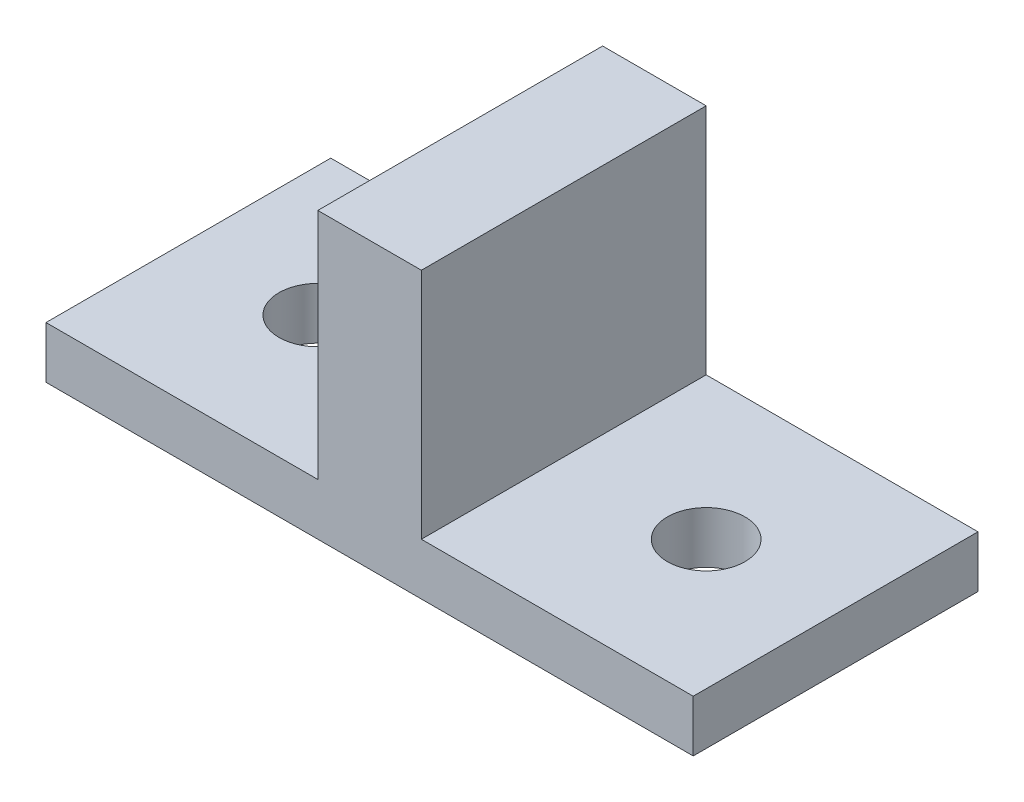
ISO-10303-21;
HEADER;
FILE_DESCRIPTION(('STEP AP214'),'2;1');
FILE_NAME('part.step','',(''),(''),'','','');
FILE_SCHEMA(('AUTOMOTIVE_DESIGN { 1 0 10303 214 1 1 1 1 }'));
ENDSEC;
DATA;
#1=APPLICATION_CONTEXT('core data for automotive mechanical design processes');
#2=APPLICATION_PROTOCOL_DEFINITION('international standard','automotive_design',2000,#1);
#3=PRODUCT_CONTEXT('',#1,'mechanical');
#4=PRODUCT('Part','Part','',(#3));
#5=PRODUCT_RELATED_PRODUCT_CATEGORY('part','',(#4));
#6=PRODUCT_DEFINITION_FORMATION('','',#4);
#7=PRODUCT_DEFINITION_CONTEXT('part definition',#1,'design');
#8=PRODUCT_DEFINITION('design','',#6,#7);
#9=PRODUCT_DEFINITION_SHAPE('','',#8);
#10=(LENGTH_UNIT() NAMED_UNIT(*) SI_UNIT(.MILLI.,.METRE.));
#11=(NAMED_UNIT(*) PLANE_ANGLE_UNIT() SI_UNIT($,.RADIAN.));
#12=(NAMED_UNIT(*) SI_UNIT($,.STERADIAN.) SOLID_ANGLE_UNIT());
#13=UNCERTAINTY_MEASURE_WITH_UNIT(LENGTH_MEASURE(1.E-05),#10,'distance_accuracy_value','');
#14=(GEOMETRIC_REPRESENTATION_CONTEXT(3) GLOBAL_UNCERTAINTY_ASSIGNED_CONTEXT((#13)) GLOBAL_UNIT_ASSIGNED_CONTEXT((#10,
#11,#12)) REPRESENTATION_CONTEXT('',''));
#15=CARTESIAN_POINT('',(0.,0.,0.));
#16=DIRECTION('',(0.,0.,1.));
#17=DIRECTION('',(1.,0.,0.));
#18=AXIS2_PLACEMENT_3D('',#15,#16,#17);
#19=CARTESIAN_POINT('',(0.,10.,0.));
#20=DIRECTION('',(0.,1.,0.));
#21=DIRECTION('',(0.,0.,1.));
#22=AXIS2_PLACEMENT_3D('',#19,#20,#21);
#23=PLANE('',#22);
#24=DIRECTION('',(0.,0.,-1.));
#25=VECTOR('',#24,1.);
#26=CARTESIAN_POINT('',(10.,10.,-27.5));
#27=LINE('',#26,#25);
#28=CARTESIAN_POINT('',(10.,10.,27.5));
#29=VERTEX_POINT('',#28);
#30=CARTESIAN_POINT('',(9.99999999999999,10.,-27.5));
#31=VERTEX_POINT('',#30);
#32=EDGE_CURVE('E59',#29,#31,#27,.T.);
#33=ORIENTED_EDGE('',*,*,#32,.F.);
#34=DIRECTION('',(1.,0.,0.));
#35=VECTOR('',#34,1.);
#36=CARTESIAN_POINT('',(-62.5,10.,27.5));
#37=LINE('',#36,#35);
#38=CARTESIAN_POINT('',(62.5,10.,27.5));
#39=VERTEX_POINT('',#38);
#40=EDGE_CURVE('E168',#29,#39,#37,.T.);
#41=ORIENTED_EDGE('',*,*,#40,.T.);
#42=DIRECTION('',(0.,0.,-1.));
#43=VECTOR('',#42,1.);
#44=CARTESIAN_POINT('',(62.4999999999999,10.,-27.5));
#45=LINE('',#44,#43);
#46=CARTESIAN_POINT('',(62.4999999999999,10.,-27.5));
#47=VERTEX_POINT('',#46);
#48=EDGE_CURVE('E156',#39,#47,#45,.T.);
#49=ORIENTED_EDGE('',*,*,#48,.T.);
#50=DIRECTION('',(-1.,0.,0.));
#51=VECTOR('',#50,1.);
#52=CARTESIAN_POINT('',(-62.5,10.,-27.5));
#53=LINE('',#52,#51);
#54=EDGE_CURVE('E162',#47,#31,#53,.T.);
#55=ORIENTED_EDGE('',*,*,#54,.T.);
#56=EDGE_LOOP('',(#33,#41,#49,#55));
#57=FACE_BOUND('',#56,.T.);
#58=CARTESIAN_POINT('',(37.5000000000001,10.,0.));
#59=DIRECTION('',(0.,1.,0.));
#60=DIRECTION('',(0.,0.,1.));
#61=AXIS2_PLACEMENT_3D('',#58,#59,#60);
#62=CIRCLE('',#61,7.5);
#63=CARTESIAN_POINT('',(37.5000000000001,10.,7.50000000000009));
#64=VERTEX_POINT('',#63);
#65=EDGE_CURVE('E133',#64,#64,#62,.F.);
#66=ORIENTED_EDGE('',*,*,#65,.T.);
#67=EDGE_LOOP('',(#66));
#68=FACE_BOUND('',#67,.T.);
#69=ADVANCED_FACE('F43',(#57,#68),#23,.T.);
#70=DIRECTION('',(0.,0.,1.));
#71=VECTOR('',#70,1.);
#72=CARTESIAN_POINT('',(-10.0000000000001,10.,27.5));
#73=LINE('',#72,#71);
#74=CARTESIAN_POINT('',(-10.0000000000001,10.,-27.5));
#75=VERTEX_POINT('',#74);
#76=CARTESIAN_POINT('',(-10.0000000000001,10.,27.5));
#77=VERTEX_POINT('',#76);
#78=EDGE_CURVE('E67',#75,#77,#73,.T.);
#79=ORIENTED_EDGE('',*,*,#78,.F.);
#80=CARTESIAN_POINT('',(-62.5,10.,-27.5));
#81=VERTEX_POINT('',#80);
#82=EDGE_CURVE('E160',#75,#81,#53,.T.);
#83=ORIENTED_EDGE('',*,*,#82,.T.);
#84=DIRECTION('',(0.,0.,1.));
#85=VECTOR('',#84,1.);
#86=CARTESIAN_POINT('',(-62.5,10.,-27.5));
#87=LINE('',#86,#85);
#88=CARTESIAN_POINT('',(-62.5,10.,27.5));
#89=VERTEX_POINT('',#88);
#90=EDGE_CURVE('E165',#81,#89,#87,.T.);
#91=ORIENTED_EDGE('',*,*,#90,.T.);
#92=EDGE_CURVE('E169',#89,#77,#37,.T.);
#93=ORIENTED_EDGE('',*,*,#92,.T.);
#94=EDGE_LOOP('',(#79,#83,#91,#93));
#95=FACE_BOUND('',#94,.T.);
#96=CARTESIAN_POINT('',(-37.5000000000001,10.,0.));
#97=DIRECTION('',(0.,1.,0.));
#98=DIRECTION('',(0.,0.,1.));
#99=AXIS2_PLACEMENT_3D('',#96,#97,#98);
#100=CIRCLE('',#99,7.5);
#101=CARTESIAN_POINT('',(-37.5000000000001,10.,7.5));
#102=VERTEX_POINT('',#101);
#103=EDGE_CURVE('E149',#102,#102,#100,.T.);
#104=ORIENTED_EDGE('',*,*,#103,.F.);
#105=EDGE_LOOP('',(#104));
#106=FACE_BOUND('',#105,.T.);
#107=ADVANCED_FACE('F213',(#95,#106),#23,.T.);
#108=CARTESIAN_POINT('',(0.,0.,0.));
#109=DIRECTION('',(0.,1.,0.));
#110=DIRECTION('',(0.,0.,1.));
#111=AXIS2_PLACEMENT_3D('',#108,#109,#110);
#112=PLANE('',#111);
#113=DIRECTION('',(0.,0.,-1.));
#114=VECTOR('',#113,1.);
#115=CARTESIAN_POINT('',(62.4999999999999,0.,-27.5));
#116=LINE('',#115,#114);
#117=CARTESIAN_POINT('',(62.5,0.,27.5));
#118=VERTEX_POINT('',#117);
#119=CARTESIAN_POINT('',(62.4999999999999,0.,-27.5));
#120=VERTEX_POINT('',#119);
#121=EDGE_CURVE('E148',#118,#120,#116,.T.);
#122=ORIENTED_EDGE('',*,*,#121,.F.);
#123=DIRECTION('',(1.,0.,0.));
#124=VECTOR('',#123,1.);
#125=CARTESIAN_POINT('',(-62.5,0.,27.5));
#126=LINE('',#125,#124);
#127=CARTESIAN_POINT('',(-62.5,0.,27.5));
#128=VERTEX_POINT('',#127);
#129=EDGE_CURVE('E161',#128,#118,#126,.T.);
#130=ORIENTED_EDGE('',*,*,#129,.F.);
#131=DIRECTION('',(0.,0.,1.));
#132=VECTOR('',#131,1.);
#133=CARTESIAN_POINT('',(-62.5,0.,-27.5));
#134=LINE('',#133,#132);
#135=CARTESIAN_POINT('',(-62.5,0.,-27.5));
#136=VERTEX_POINT('',#135);
#137=EDGE_CURVE('E179',#136,#128,#134,.T.);
#138=ORIENTED_EDGE('',*,*,#137,.F.);
#139=DIRECTION('',(-1.,0.,0.));
#140=VECTOR('',#139,1.);
#141=CARTESIAN_POINT('',(-62.5,0.,-27.5));
#142=LINE('',#141,#140);
#143=EDGE_CURVE('E176',#120,#136,#142,.T.);
#144=ORIENTED_EDGE('',*,*,#143,.F.);
#145=EDGE_LOOP('',(#122,#130,#138,#144));
#146=FACE_BOUND('',#145,.T.);
#147=CARTESIAN_POINT('',(37.5000000000001,0.,0.));
#148=DIRECTION('',(0.,1.,0.));
#149=DIRECTION('',(0.,0.,1.));
#150=AXIS2_PLACEMENT_3D('',#147,#148,#149);
#151=CIRCLE('',#150,7.5);
#152=CARTESIAN_POINT('',(37.5000000000001,0.,7.50000000000009));
#153=VERTEX_POINT('',#152);
#154=EDGE_CURVE('E138',#153,#153,#151,.F.);
#155=ORIENTED_EDGE('',*,*,#154,.F.);
#156=EDGE_LOOP('',(#155));
#157=FACE_BOUND('',#156,.T.);
#158=CARTESIAN_POINT('',(-37.5000000000001,0.,0.));
#159=DIRECTION('',(0.,1.,0.));
#160=DIRECTION('',(0.,0.,1.));
#161=AXIS2_PLACEMENT_3D('',#158,#159,#160);
#162=CIRCLE('',#161,7.5);
#163=CARTESIAN_POINT('',(-37.5000000000001,0.,7.5));
#164=VERTEX_POINT('',#163);
#165=EDGE_CURVE('E144',#164,#164,#162,.T.);
#166=ORIENTED_EDGE('',*,*,#165,.T.);
#167=EDGE_LOOP('',(#166));
#168=FACE_BOUND('',#167,.T.);
#169=ADVANCED_FACE('F201',(#146,#157,#168),#112,.F.);
#170=CARTESIAN_POINT('',(62.4999999999999,10.,-27.5));
#171=DIRECTION('',(-1.,0.,0.));
#172=DIRECTION('',(0.,0.,1.));
#173=AXIS2_PLACEMENT_3D('',#170,#171,#172);
#174=PLANE('',#173);
#175=ORIENTED_EDGE('',*,*,#121,.T.);
#176=DIRECTION('',(0.,-1.,0.));
#177=VECTOR('',#176,1.);
#178=CARTESIAN_POINT('',(62.4999999999999,10.,-27.5));
#179=LINE('',#178,#177);
#180=EDGE_CURVE('E11',#47,#120,#179,.T.);
#181=ORIENTED_EDGE('',*,*,#180,.F.);
#182=ORIENTED_EDGE('',*,*,#48,.F.);
#183=DIRECTION('',(0.,-1.,0.));
#184=VECTOR('',#183,1.);
#185=CARTESIAN_POINT('',(62.5,10.,27.5));
#186=LINE('',#185,#184);
#187=EDGE_CURVE('E172',#39,#118,#186,.T.);
#188=ORIENTED_EDGE('',*,*,#187,.T.);
#189=EDGE_LOOP('',(#175,#181,#182,#188));
#190=FACE_BOUND('',#189,.T.);
#191=ADVANCED_FACE('F45',(#190),#174,.F.);
#192=CARTESIAN_POINT('',(-62.5,10.,-27.5));
#193=DIRECTION('',(0.,0.,1.));
#194=DIRECTION('',(1.,0.,0.));
#195=AXIS2_PLACEMENT_3D('',#192,#193,#194);
#196=PLANE('',#195);
#197=ORIENTED_EDGE('',*,*,#143,.T.);
#198=DIRECTION('',(0.,-1.,0.));
#199=VECTOR('',#198,1.);
#200=CARTESIAN_POINT('',(-62.5,10.,-27.5));
#201=LINE('',#200,#199);
#202=EDGE_CURVE('E52',#81,#136,#201,.T.);
#203=ORIENTED_EDGE('',*,*,#202,.F.);
#204=ORIENTED_EDGE('',*,*,#82,.F.);
#205=DIRECTION('',(0.,-1.,0.));
#206=VECTOR('',#205,1.);
#207=CARTESIAN_POINT('',(-10.0000000000001,55.,-27.5));
#208=LINE('',#207,#206);
#209=CARTESIAN_POINT('',(-10.0000000000001,55.,-27.5));
#210=VERTEX_POINT('',#209);
#211=EDGE_CURVE('E115',#210,#75,#208,.T.);
#212=ORIENTED_EDGE('',*,*,#211,.F.);
#213=DIRECTION('',(-1.,0.,0.));
#214=VECTOR('',#213,1.);
#215=CARTESIAN_POINT('',(-10.0000000000001,55.,-27.5));
#216=LINE('',#215,#214);
#217=CARTESIAN_POINT('',(10.,55.,-27.5));
#218=VERTEX_POINT('',#217);
#219=EDGE_CURVE('E109',#218,#210,#216,.T.);
#220=ORIENTED_EDGE('',*,*,#219,.F.);
#221=DIRECTION('',(0.,-1.,0.));
#222=VECTOR('',#221,1.);
#223=CARTESIAN_POINT('',(10.,55.,-27.5));
#224=LINE('',#223,#222);
#225=EDGE_CURVE('E113',#218,#31,#224,.T.);
#226=ORIENTED_EDGE('',*,*,#225,.T.);
#227=ORIENTED_EDGE('',*,*,#54,.F.);
#228=ORIENTED_EDGE('',*,*,#180,.T.);
#229=EDGE_LOOP('',(#197,#203,#204,#212,#220,#226,#227,#228));
#230=FACE_BOUND('',#229,.T.);
#231=ADVANCED_FACE('F111',(#230),#196,.F.);
#232=CARTESIAN_POINT('',(-62.5,10.,-27.5));
#233=DIRECTION('',(1.,0.,0.));
#234=DIRECTION('',(0.,0.,-1.));
#235=AXIS2_PLACEMENT_3D('',#232,#233,#234);
#236=PLANE('',#235);
#237=ORIENTED_EDGE('',*,*,#137,.T.);
#238=DIRECTION('',(0.,-1.,0.));
#239=VECTOR('',#238,1.);
#240=CARTESIAN_POINT('',(-62.5,10.,27.5));
#241=LINE('',#240,#239);
#242=EDGE_CURVE('E187',#89,#128,#241,.T.);
#243=ORIENTED_EDGE('',*,*,#242,.F.);
#244=ORIENTED_EDGE('',*,*,#90,.F.);
#245=ORIENTED_EDGE('',*,*,#202,.T.);
#246=EDGE_LOOP('',(#237,#243,#244,#245));
#247=FACE_BOUND('',#246,.T.);
#248=ADVANCED_FACE('F196',(#247),#236,.F.);
#249=CARTESIAN_POINT('',(-62.5,10.,27.5));
#250=DIRECTION('',(0.,0.,-1.));
#251=DIRECTION('',(-1.,0.,0.));
#252=AXIS2_PLACEMENT_3D('',#249,#250,#251);
#253=PLANE('',#252);
#254=ORIENTED_EDGE('',*,*,#129,.T.);
#255=ORIENTED_EDGE('',*,*,#187,.F.);
#256=ORIENTED_EDGE('',*,*,#40,.F.);
#257=DIRECTION('',(0.,-1.,0.));
#258=VECTOR('',#257,1.);
#259=CARTESIAN_POINT('',(10.,55.,27.5));
#260=LINE('',#259,#258);
#261=CARTESIAN_POINT('',(10.,55.,27.5));
#262=VERTEX_POINT('',#261);
#263=EDGE_CURVE('E222',#262,#29,#260,.T.);
#264=ORIENTED_EDGE('',*,*,#263,.F.);
#265=DIRECTION('',(1.,0.,0.));
#266=VECTOR('',#265,1.);
#267=CARTESIAN_POINT('',(-10.0000000000001,55.,27.5));
#268=LINE('',#267,#266);
#269=CARTESIAN_POINT('',(-10.0000000000001,55.,27.5));
#270=VERTEX_POINT('',#269);
#271=EDGE_CURVE('E125',#270,#262,#268,.T.);
#272=ORIENTED_EDGE('',*,*,#271,.F.);
#273=DIRECTION('',(0.,-1.,0.));
#274=VECTOR('',#273,1.);
#275=CARTESIAN_POINT('',(-10.0000000000001,55.,27.5));
#276=LINE('',#275,#274);
#277=EDGE_CURVE('E140',#270,#77,#276,.T.);
#278=ORIENTED_EDGE('',*,*,#277,.T.);
#279=ORIENTED_EDGE('',*,*,#92,.F.);
#280=ORIENTED_EDGE('',*,*,#242,.T.);
#281=EDGE_LOOP('',(#254,#255,#256,#264,#272,#278,#279,#280));
#282=FACE_BOUND('',#281,.T.);
#283=ADVANCED_FACE('F205',(#282),#253,.F.);
#284=CARTESIAN_POINT('',(37.5000000000001,0.,0.));
#285=DIRECTION('',(0.,1.,0.));
#286=DIRECTION('',(0.,0.,1.));
#287=AXIS2_PLACEMENT_3D('',#284,#285,#286);
#288=CYLINDRICAL_SURFACE('',#287,7.5);
#289=ORIENTED_EDGE('',*,*,#154,.T.);
#290=EDGE_LOOP('',(#289));
#291=FACE_BOUND('',#290,.T.);
#292=ORIENTED_EDGE('',*,*,#65,.F.);
#293=EDGE_LOOP('',(#292));
#294=FACE_BOUND('',#293,.T.);
#295=ADVANCED_FACE('F247',(#291,#294),#288,.F.);
#296=CARTESIAN_POINT('',(-37.5000000000001,0.,0.));
#297=DIRECTION('',(0.,1.,0.));
#298=DIRECTION('',(0.,0.,1.));
#299=AXIS2_PLACEMENT_3D('',#296,#297,#298);
#300=CYLINDRICAL_SURFACE('',#299,7.5);
#301=ORIENTED_EDGE('',*,*,#165,.F.);
#302=EDGE_LOOP('',(#301));
#303=FACE_BOUND('',#302,.T.);
#304=ORIENTED_EDGE('',*,*,#103,.T.);
#305=EDGE_LOOP('',(#304));
#306=FACE_BOUND('',#305,.T.);
#307=ADVANCED_FACE('F238',(#303,#306),#300,.F.);
#308=CARTESIAN_POINT('',(10.,55.,-27.5));
#309=DIRECTION('',(-1.,0.,0.));
#310=DIRECTION('',(0.,0.,1.));
#311=AXIS2_PLACEMENT_3D('',#308,#309,#310);
#312=PLANE('',#311);
#313=ORIENTED_EDGE('',*,*,#32,.T.);
#314=ORIENTED_EDGE('',*,*,#225,.F.);
#315=DIRECTION('',(0.,0.,-1.));
#316=VECTOR('',#315,1.);
#317=CARTESIAN_POINT('',(10.,55.,-27.5));
#318=LINE('',#317,#316);
#319=EDGE_CURVE('E120',#262,#218,#318,.T.);
#320=ORIENTED_EDGE('',*,*,#319,.F.);
#321=ORIENTED_EDGE('',*,*,#263,.T.);
#322=EDGE_LOOP('',(#313,#314,#320,#321));
#323=FACE_BOUND('',#322,.T.);
#324=ADVANCED_FACE('F131',(#323),#312,.F.);
#325=CARTESIAN_POINT('',(-10.0000000000001,55.,27.5));
#326=DIRECTION('',(1.,0.,0.));
#327=DIRECTION('',(0.,0.,-1.));
#328=AXIS2_PLACEMENT_3D('',#325,#326,#327);
#329=PLANE('',#328);
#330=ORIENTED_EDGE('',*,*,#78,.T.);
#331=ORIENTED_EDGE('',*,*,#277,.F.);
#332=DIRECTION('',(0.,0.,1.));
#333=VECTOR('',#332,1.);
#334=CARTESIAN_POINT('',(-10.0000000000001,55.,27.5));
#335=LINE('',#334,#333);
#336=EDGE_CURVE('E119',#210,#270,#335,.T.);
#337=ORIENTED_EDGE('',*,*,#336,.F.);
#338=ORIENTED_EDGE('',*,*,#211,.T.);
#339=EDGE_LOOP('',(#330,#331,#337,#338));
#340=FACE_BOUND('',#339,.T.);
#341=ADVANCED_FACE('F216',(#340),#329,.F.);
#342=CARTESIAN_POINT('',(0.,55.,0.));
#343=DIRECTION('',(0.,1.,0.));
#344=DIRECTION('',(0.,0.,1.));
#345=AXIS2_PLACEMENT_3D('',#342,#343,#344);
#346=PLANE('',#345);
#347=ORIENTED_EDGE('',*,*,#319,.T.);
#348=ORIENTED_EDGE('',*,*,#219,.T.);
#349=ORIENTED_EDGE('',*,*,#336,.T.);
#350=ORIENTED_EDGE('',*,*,#271,.T.);
#351=EDGE_LOOP('',(#347,#348,#349,#350));
#352=FACE_BOUND('',#351,.T.);
#353=ADVANCED_FACE('F123',(#352),#346,.T.);
#354=CLOSED_SHELL('',(#69,#107,#169,#191,#231,#248,#283,#295,#307,#324,#341,#353));
#355=MANIFOLD_SOLID_BREP('B2',#354);
#356=ADVANCED_BREP_SHAPE_REPRESENTATION('',(#18,#355),#14);
#357=SHAPE_DEFINITION_REPRESENTATION(#9,#356);
ENDSEC;
END-ISO-10303-21;
